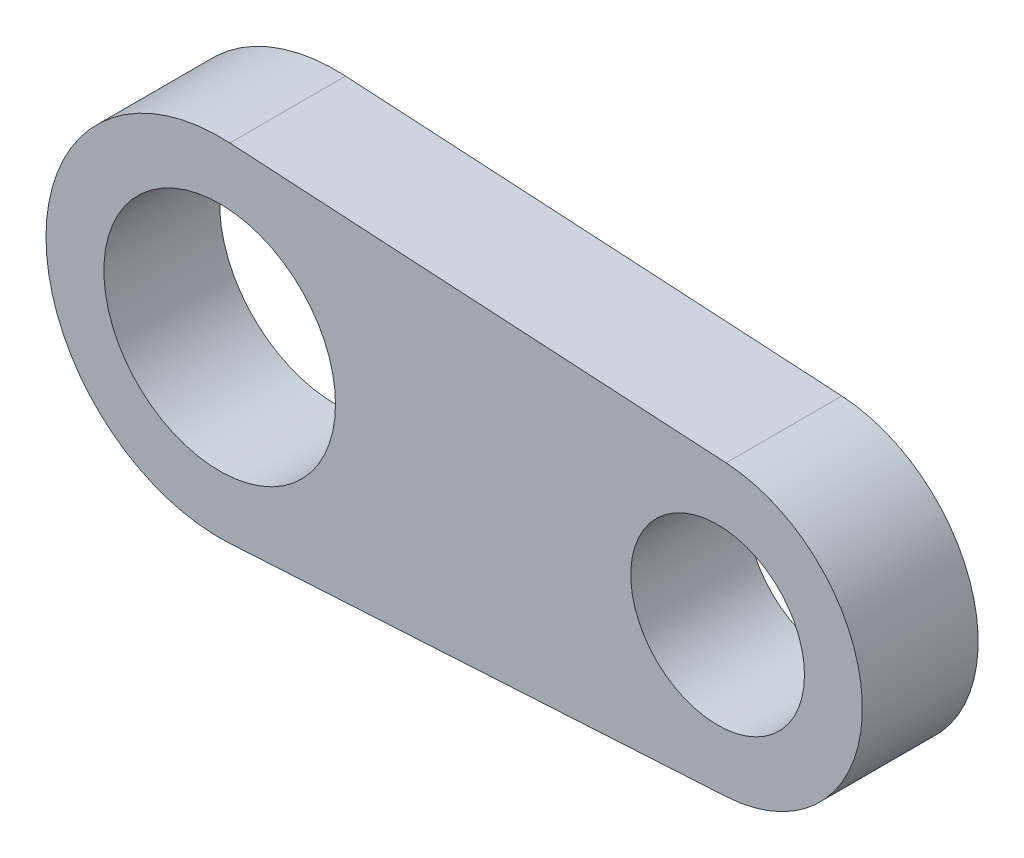
ISO-10303-21;
HEADER;
FILE_DESCRIPTION(('STEP AP214'),'2;1');
FILE_NAME('part.step','',(''),(''),'','','');
FILE_SCHEMA(('AUTOMOTIVE_DESIGN { 1 0 10303 214 1 1 1 1 }'));
ENDSEC;
DATA;
#1=APPLICATION_CONTEXT('core data for automotive mechanical design processes');
#2=APPLICATION_PROTOCOL_DEFINITION('international standard','automotive_design',2000,#1);
#3=PRODUCT_CONTEXT('',#1,'mechanical');
#4=PRODUCT('Part','Part','',(#3));
#5=PRODUCT_RELATED_PRODUCT_CATEGORY('part','',(#4));
#6=PRODUCT_DEFINITION_FORMATION('','',#4);
#7=PRODUCT_DEFINITION_CONTEXT('part definition',#1,'design');
#8=PRODUCT_DEFINITION('design','',#6,#7);
#9=PRODUCT_DEFINITION_SHAPE('','',#8);
#10=(LENGTH_UNIT() NAMED_UNIT(*) SI_UNIT(.MILLI.,.METRE.));
#11=(NAMED_UNIT(*) PLANE_ANGLE_UNIT() SI_UNIT($,.RADIAN.));
#12=(NAMED_UNIT(*) SI_UNIT($,.STERADIAN.) SOLID_ANGLE_UNIT());
#13=UNCERTAINTY_MEASURE_WITH_UNIT(LENGTH_MEASURE(1.E-05),#10,'distance_accuracy_value','');
#14=(GEOMETRIC_REPRESENTATION_CONTEXT(3) GLOBAL_UNCERTAINTY_ASSIGNED_CONTEXT((#13)) GLOBAL_UNIT_ASSIGNED_CONTEXT((#10,
#11,#12)) REPRESENTATION_CONTEXT('',''));
#15=CARTESIAN_POINT('',(0.,0.,0.));
#16=DIRECTION('',(0.,0.,1.));
#17=DIRECTION('',(1.,0.,0.));
#18=AXIS2_PLACEMENT_3D('',#15,#16,#17);
#19=CARTESIAN_POINT('',(0.,0.,-5.));
#20=DIRECTION('',(0.,0.,1.));
#21=DIRECTION('',(1.,0.,0.));
#22=AXIS2_PLACEMENT_3D('',#19,#20,#21);
#23=CYLINDRICAL_SURFACE('',#22,15.);
#24=DIRECTION('',(0.,0.,1.));
#25=VECTOR('',#24,1.);
#26=CARTESIAN_POINT('',(0.872093023255813,-14.9746269989869,-5.));
#27=LINE('',#26,#25);
#28=CARTESIAN_POINT('',(0.872093023255813,-14.9746269989869,-5.));
#29=VERTEX_POINT('',#28);
#30=CARTESIAN_POINT('',(0.872093023255813,-14.9746269989869,5.));
#31=VERTEX_POINT('',#30);
#32=EDGE_CURVE('E39',#29,#31,#27,.T.);
#33=ORIENTED_EDGE('',*,*,#32,.T.);
#34=CARTESIAN_POINT('',(0.,0.,5.));
#35=DIRECTION('',(0.,0.,1.));
#36=DIRECTION('',(1.,0.,0.));
#37=AXIS2_PLACEMENT_3D('',#34,#35,#36);
#38=CIRCLE('',#37,15.);
#39=CARTESIAN_POINT('',(0.872093023255816,14.9746269989869,5.));
#40=VERTEX_POINT('',#39);
#41=EDGE_CURVE('E76',#40,#31,#38,.T.);
#42=ORIENTED_EDGE('',*,*,#41,.F.);
#43=DIRECTION('',(0.,0.,1.));
#44=VECTOR('',#43,1.);
#45=CARTESIAN_POINT('',(0.872093023255816,14.9746269989869,-5.));
#46=LINE('',#45,#44);
#47=CARTESIAN_POINT('',(0.872093023255816,14.9746269989869,-5.));
#48=VERTEX_POINT('',#47);
#49=EDGE_CURVE('E11',#48,#40,#46,.T.);
#50=ORIENTED_EDGE('',*,*,#49,.F.);
#51=CARTESIAN_POINT('',(0.,0.,-5.));
#52=DIRECTION('',(0.,0.,1.));
#53=DIRECTION('',(1.,0.,0.));
#54=AXIS2_PLACEMENT_3D('',#51,#52,#53);
#55=CIRCLE('',#54,15.);
#56=EDGE_CURVE('E77',#48,#29,#55,.T.);
#57=ORIENTED_EDGE('',*,*,#56,.T.);
#58=EDGE_LOOP('',(#33,#42,#50,#57));
#59=FACE_BOUND('',#58,.T.);
#60=ADVANCED_FACE('F36',(#59),#23,.T.);
#61=CARTESIAN_POINT('',(0.872093023255816,14.9746269989869,-5.));
#62=DIRECTION('',(0.0581395348837211,0.998308466599129,0.));
#63=DIRECTION('',(-0.998308466599129,0.0581395348837211,0.));
#64=AXIS2_PLACEMENT_3D('',#61,#62,#63);
#65=PLANE('',#64);
#66=ORIENTED_EDGE('',*,*,#49,.T.);
#67=DIRECTION('',(-0.998308466599129,0.0581395348837211,0.));
#68=VECTOR('',#67,1.);
#69=CARTESIAN_POINT('',(0.872093023255816,14.9746269989869,5.));
#70=LINE('',#69,#68);
#71=CARTESIAN_POINT('',(43.7267441860465,12.4788558324891,5.));
#72=VERTEX_POINT('',#71);
#73=EDGE_CURVE('E94',#72,#40,#70,.T.);
#74=ORIENTED_EDGE('',*,*,#73,.F.);
#75=DIRECTION('',(0.,0.,1.));
#76=VECTOR('',#75,1.);
#77=CARTESIAN_POINT('',(43.7267441860465,12.4788558324891,-5.));
#78=LINE('',#77,#76);
#79=CARTESIAN_POINT('',(43.7267441860465,12.4788558324891,-5.));
#80=VERTEX_POINT('',#79);
#81=EDGE_CURVE('E44',#80,#72,#78,.T.);
#82=ORIENTED_EDGE('',*,*,#81,.F.);
#83=DIRECTION('',(-0.998308466599129,0.0581395348837211,0.));
#84=VECTOR('',#83,1.);
#85=CARTESIAN_POINT('',(0.872093023255816,14.9746269989869,-5.));
#86=LINE('',#85,#84);
#87=EDGE_CURVE('E82',#80,#48,#86,.T.);
#88=ORIENTED_EDGE('',*,*,#87,.T.);
#89=EDGE_LOOP('',(#66,#74,#82,#88));
#90=FACE_BOUND('',#89,.T.);
#91=ADVANCED_FACE('F120',(#90),#65,.T.);
#92=CARTESIAN_POINT('',(43.,0.,-5.));
#93=DIRECTION('',(0.,0.,1.));
#94=DIRECTION('',(1.,0.,0.));
#95=AXIS2_PLACEMENT_3D('',#92,#93,#94);
#96=CYLINDRICAL_SURFACE('',#95,12.5);
#97=ORIENTED_EDGE('',*,*,#81,.T.);
#98=CARTESIAN_POINT('',(43.,0.,5.));
#99=DIRECTION('',(0.,0.,1.));
#100=DIRECTION('',(1.,0.,0.));
#101=AXIS2_PLACEMENT_3D('',#98,#99,#100);
#102=CIRCLE('',#101,12.5);
#103=CARTESIAN_POINT('',(43.7267441860465,-12.4788558324891,5.));
#104=VERTEX_POINT('',#103);
#105=EDGE_CURVE('E89',#104,#72,#102,.T.);
#106=ORIENTED_EDGE('',*,*,#105,.F.);
#107=DIRECTION('',(0.,0.,1.));
#108=VECTOR('',#107,1.);
#109=CARTESIAN_POINT('',(43.7267441860465,-12.4788558324891,-5.));
#110=LINE('',#109,#108);
#111=CARTESIAN_POINT('',(43.7267441860465,-12.4788558324891,-5.));
#112=VERTEX_POINT('',#111);
#113=EDGE_CURVE('E81',#112,#104,#110,.T.);
#114=ORIENTED_EDGE('',*,*,#113,.F.);
#115=CARTESIAN_POINT('',(43.,0.,-5.));
#116=DIRECTION('',(0.,0.,1.));
#117=DIRECTION('',(1.,0.,0.));
#118=AXIS2_PLACEMENT_3D('',#115,#116,#117);
#119=CIRCLE('',#118,12.5);
#120=EDGE_CURVE('E113',#112,#80,#119,.T.);
#121=ORIENTED_EDGE('',*,*,#120,.T.);
#122=EDGE_LOOP('',(#97,#106,#114,#121));
#123=FACE_BOUND('',#122,.T.);
#124=ADVANCED_FACE('F117',(#123),#96,.T.);
#125=CARTESIAN_POINT('',(0.872093023255813,-14.9746269989869,-5.));
#126=DIRECTION('',(0.0581395348837209,-0.998308466599129,0.));
#127=DIRECTION('',(0.998308466599129,0.058139534883721,0.));
#128=AXIS2_PLACEMENT_3D('',#125,#126,#127);
#129=PLANE('',#128);
#130=ORIENTED_EDGE('',*,*,#113,.T.);
#131=DIRECTION('',(0.998308466599129,0.0581395348837209,0.));
#132=VECTOR('',#131,1.);
#133=CARTESIAN_POINT('',(0.872093023255813,-14.9746269989869,5.));
#134=LINE('',#133,#132);
#135=EDGE_CURVE('E84',#31,#104,#134,.T.);
#136=ORIENTED_EDGE('',*,*,#135,.F.);
#137=ORIENTED_EDGE('',*,*,#32,.F.);
#138=DIRECTION('',(0.998308466599129,0.0581395348837209,0.));
#139=VECTOR('',#138,1.);
#140=CARTESIAN_POINT('',(0.872093023255813,-14.9746269989869,-5.));
#141=LINE('',#140,#139);
#142=EDGE_CURVE('E111',#29,#112,#141,.T.);
#143=ORIENTED_EDGE('',*,*,#142,.T.);
#144=EDGE_LOOP('',(#130,#136,#137,#143));
#145=FACE_BOUND('',#144,.T.);
#146=ADVANCED_FACE('F85',(#145),#129,.T.);
#147=CARTESIAN_POINT('',(0.,0.,-5.));
#148=DIRECTION('',(0.,0.,1.));
#149=DIRECTION('',(1.,0.,0.));
#150=AXIS2_PLACEMENT_3D('',#147,#148,#149);
#151=PLANE('',#150);
#152=CARTESIAN_POINT('',(43.,0.,-5.));
#153=DIRECTION('',(0.,0.,1.));
#154=DIRECTION('',(1.,0.,0.));
#155=AXIS2_PLACEMENT_3D('',#152,#153,#154);
#156=CIRCLE('',#155,7.5);
#157=CARTESIAN_POINT('',(50.5,0.,-5.));
#158=VERTEX_POINT('',#157);
#159=EDGE_CURVE('E104',#158,#158,#156,.T.);
#160=ORIENTED_EDGE('',*,*,#159,.T.);
#161=EDGE_LOOP('',(#160));
#162=FACE_BOUND('',#161,.T.);
#163=CARTESIAN_POINT('',(0.,0.,-5.));
#164=DIRECTION('',(0.,0.,1.));
#165=DIRECTION('',(1.,0.,0.));
#166=AXIS2_PLACEMENT_3D('',#163,#164,#165);
#167=CIRCLE('',#166,10.);
#168=CARTESIAN_POINT('',(10.,0.,-5.));
#169=VERTEX_POINT('',#168);
#170=EDGE_CURVE('E107',#169,#169,#167,.T.);
#171=ORIENTED_EDGE('',*,*,#170,.T.);
#172=EDGE_LOOP('',(#171));
#173=FACE_BOUND('',#172,.T.);
#174=ORIENTED_EDGE('',*,*,#56,.F.);
#175=ORIENTED_EDGE('',*,*,#87,.F.);
#176=ORIENTED_EDGE('',*,*,#120,.F.);
#177=ORIENTED_EDGE('',*,*,#142,.F.);
#178=EDGE_LOOP('',(#174,#175,#176,#177));
#179=FACE_BOUND('',#178,.T.);
#180=ADVANCED_FACE('F122',(#162,#173,#179),#151,.F.);
#181=CARTESIAN_POINT('',(0.,0.,-5.));
#182=DIRECTION('',(0.,0.,1.));
#183=DIRECTION('',(1.,0.,0.));
#184=AXIS2_PLACEMENT_3D('',#181,#182,#183);
#185=CYLINDRICAL_SURFACE('',#184,10.);
#186=ORIENTED_EDGE('',*,*,#170,.F.);
#187=EDGE_LOOP('',(#186));
#188=FACE_BOUND('',#187,.T.);
#189=CARTESIAN_POINT('',(0.,0.,5.));
#190=DIRECTION('',(0.,0.,1.));
#191=DIRECTION('',(1.,0.,0.));
#192=AXIS2_PLACEMENT_3D('',#189,#190,#191);
#193=CIRCLE('',#192,10.);
#194=CARTESIAN_POINT('',(10.,0.,5.));
#195=VERTEX_POINT('',#194);
#196=EDGE_CURVE('E95',#195,#195,#193,.T.);
#197=ORIENTED_EDGE('',*,*,#196,.T.);
#198=EDGE_LOOP('',(#197));
#199=FACE_BOUND('',#198,.T.);
#200=ADVANCED_FACE('F124',(#188,#199),#185,.F.);
#201=CARTESIAN_POINT('',(43.,0.,-5.));
#202=DIRECTION('',(0.,0.,1.));
#203=DIRECTION('',(1.,0.,0.));
#204=AXIS2_PLACEMENT_3D('',#201,#202,#203);
#205=CYLINDRICAL_SURFACE('',#204,7.5);
#206=ORIENTED_EDGE('',*,*,#159,.F.);
#207=EDGE_LOOP('',(#206));
#208=FACE_BOUND('',#207,.T.);
#209=CARTESIAN_POINT('',(43.,0.,5.));
#210=DIRECTION('',(0.,0.,1.));
#211=DIRECTION('',(1.,0.,0.));
#212=AXIS2_PLACEMENT_3D('',#209,#210,#211);
#213=CIRCLE('',#212,7.5);
#214=CARTESIAN_POINT('',(50.5,0.,5.));
#215=VERTEX_POINT('',#214);
#216=EDGE_CURVE('E98',#215,#215,#213,.T.);
#217=ORIENTED_EDGE('',*,*,#216,.T.);
#218=EDGE_LOOP('',(#217));
#219=FACE_BOUND('',#218,.T.);
#220=ADVANCED_FACE('F131',(#208,#219),#205,.F.);
#221=CARTESIAN_POINT('',(0.,0.,5.));
#222=DIRECTION('',(0.,0.,1.));
#223=DIRECTION('',(1.,0.,0.));
#224=AXIS2_PLACEMENT_3D('',#221,#222,#223);
#225=PLANE('',#224);
#226=ORIENTED_EDGE('',*,*,#196,.F.);
#227=EDGE_LOOP('',(#226));
#228=FACE_BOUND('',#227,.T.);
#229=ORIENTED_EDGE('',*,*,#41,.T.);
#230=ORIENTED_EDGE('',*,*,#135,.T.);
#231=ORIENTED_EDGE('',*,*,#105,.T.);
#232=ORIENTED_EDGE('',*,*,#73,.T.);
#233=EDGE_LOOP('',(#229,#230,#231,#232));
#234=FACE_BOUND('',#233,.T.);
#235=ORIENTED_EDGE('',*,*,#216,.F.);
#236=EDGE_LOOP('',(#235));
#237=FACE_BOUND('',#236,.T.);
#238=ADVANCED_FACE('F92',(#228,#234,#237),#225,.T.);
#239=CLOSED_SHELL('',(#60,#91,#124,#146,#180,#200,#220,#238));
#240=MANIFOLD_SOLID_BREP('B2',#239);
#241=ADVANCED_BREP_SHAPE_REPRESENTATION('',(#18,#240),#14);
#242=SHAPE_DEFINITION_REPRESENTATION(#9,#241);
ENDSEC;
END-ISO-10303-21;
